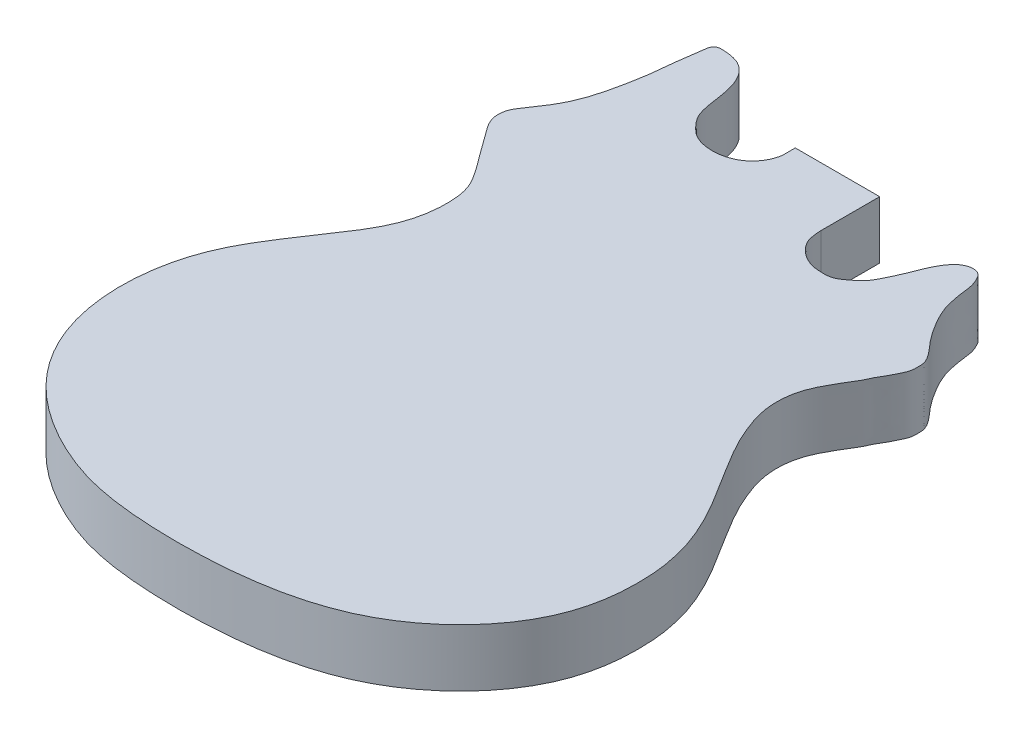
ISO-10303-21;
HEADER;
FILE_DESCRIPTION(('STEP AP214'),'2;1');
FILE_NAME('part.step','',(''),(''),'','','');
FILE_SCHEMA(('AUTOMOTIVE_DESIGN { 1 0 10303 214 1 1 1 1 }'));
ENDSEC;
DATA;
#1=APPLICATION_CONTEXT('core data for automotive mechanical design processes');
#2=APPLICATION_PROTOCOL_DEFINITION('international standard','automotive_design',2000,#1);
#3=PRODUCT_CONTEXT('',#1,'mechanical');
#4=PRODUCT('Part','Part','',(#3));
#5=PRODUCT_RELATED_PRODUCT_CATEGORY('part','',(#4));
#6=PRODUCT_DEFINITION_FORMATION('','',#4);
#7=PRODUCT_DEFINITION_CONTEXT('part definition',#1,'design');
#8=PRODUCT_DEFINITION('design','',#6,#7);
#9=PRODUCT_DEFINITION_SHAPE('','',#8);
#10=(LENGTH_UNIT() NAMED_UNIT(*) SI_UNIT(.MILLI.,.METRE.));
#11=(NAMED_UNIT(*) PLANE_ANGLE_UNIT() SI_UNIT($,.RADIAN.));
#12=(NAMED_UNIT(*) SI_UNIT($,.STERADIAN.) SOLID_ANGLE_UNIT());
#13=UNCERTAINTY_MEASURE_WITH_UNIT(LENGTH_MEASURE(1.E-05),#10,'distance_accuracy_value','');
#14=(GEOMETRIC_REPRESENTATION_CONTEXT(3) GLOBAL_UNCERTAINTY_ASSIGNED_CONTEXT((#13)) GLOBAL_UNIT_ASSIGNED_CONTEXT((#10,
#11,#12)) REPRESENTATION_CONTEXT('',''));
#15=CARTESIAN_POINT('',(0.,0.,0.));
#16=DIRECTION('',(0.,0.,1.));
#17=DIRECTION('',(1.,0.,0.));
#18=AXIS2_PLACEMENT_3D('',#15,#16,#17);
#19=CARTESIAN_POINT('',(366.883991573237,38.1,-590.196800388687));
#20=CARTESIAN_POINT('',(366.883991573237,38.1,-588.721907351672));
#21=CARTESIAN_POINT('',(367.195388840105,38.1,-585.91608313562));
#22=CARTESIAN_POINT('',(367.858429296302,38.1,-580.8687302054));
#23=CARTESIAN_POINT('',(370.218301131075,38.1,-576.638003720867));
#24=CARTESIAN_POINT('',(373.65596720719,38.1,-572.913912014376));
#25=CARTESIAN_POINT('',(377.743592341641,38.1,-569.646373817013));
#26=CARTESIAN_POINT('',(383.573889567356,38.1,-566.89859658351));
#27=CARTESIAN_POINT('',(390.451252724685,38.1,-566.258156737238));
#28=CARTESIAN_POINT('',(398.152644545368,38.1,-566.26153051699));
#29=CARTESIAN_POINT('',(404.588586625242,38.1,-571.033731222751));
#30=CARTESIAN_POINT('',(410.94967782355,38.1,-576.083704952531));
#31=CARTESIAN_POINT('',(415.321825984156,38.1,-584.401338354182));
#32=CARTESIAN_POINT('',(420.868571165765,38.1,-596.522757489768));
#33=CARTESIAN_POINT('',(424.957746783667,38.1,-609.03561704097));
#34=CARTESIAN_POINT('',(432.264639136456,38.1,-616.878386573491));
#35=CARTESIAN_POINT('',(437.693112662697,38.1,-619.093714190286));
#36=CARTESIAN_POINT('',(443.851152806028,38.1,-618.351944039827));
#37=CARTESIAN_POINT('',(446.515597074251,38.1,-613.311370609129));
#38=CARTESIAN_POINT('',(448.642354149267,38.1,-608.20368221213));
#39=CARTESIAN_POINT('',(449.063572551627,38.1,-602.574784341445));
#40=CARTESIAN_POINT('',(450.111658882252,38.1,-596.350402715852));
#41=CARTESIAN_POINT('',(451.680776414614,38.1,-587.862190500691));
#42=CARTESIAN_POINT('',(455.511908319344,38.1,-579.431931165118));
#43=CARTESIAN_POINT('',(460.76097729227,38.1,-570.728089525204));
#44=CARTESIAN_POINT('',(465.715796968027,38.1,-563.472999064495));
#45=CARTESIAN_POINT('',(471.225219476219,38.1,-557.625409544713));
#46=CARTESIAN_POINT('',(474.960319598487,38.1,-552.644338218503));
#47=CARTESIAN_POINT('',(477.041501222313,38.1,-548.646797619191));
#48=CARTESIAN_POINT('',(477.23214677891,38.1,-544.285595261758));
#49=CARTESIAN_POINT('',(477.179636977307,38.1,-538.900735945151));
#50=CARTESIAN_POINT('',(474.785544223896,38.1,-534.530358586376));
#51=CARTESIAN_POINT('',(471.971226614114,38.1,-528.396725226643));
#52=CARTESIAN_POINT('',(468.616650654354,38.1,-523.796068396358));
#53=CARTESIAN_POINT('',(466.538136299835,38.1,-518.275183369377));
#54=CARTESIAN_POINT('',(463.841343100274,38.1,-514.164090622732));
#55=CARTESIAN_POINT('',(460.300299461501,38.1,-508.10013855362));
#56=CARTESIAN_POINT('',(455.907780505751,38.1,-500.53125053286));
#57=CARTESIAN_POINT('',(452.391236223232,38.1,-492.092848174662));
#58=CARTESIAN_POINT('',(449.981513310686,38.1,-481.130095668032));
#59=CARTESIAN_POINT('',(450.56986982645,38.1,-467.189431041891));
#60=CARTESIAN_POINT('',(455.572045787537,38.1,-453.111149682231));
#61=CARTESIAN_POINT('',(460.750769387498,38.1,-441.535036147306));
#62=CARTESIAN_POINT('',(477.292195873029,38.1,-412.245927357529));
#63=CARTESIAN_POINT('',(496.864695249168,38.1,-386.695703012219));
#64=CARTESIAN_POINT('',(505.597355071709,38.1,-354.323158527018));
#65=CARTESIAN_POINT('',(507.493636288404,38.1,-344.994874506348));
#66=CARTESIAN_POINT('',(508.284460090054,38.1,-331.977291801679));
#67=CARTESIAN_POINT('',(508.412874582396,38.1,-314.027258268923));
#68=CARTESIAN_POINT('',(501.38819593534,38.1,-276.24400292031));
#69=CARTESIAN_POINT('',(472.863087886817,38.1,-240.162021779437));
#70=CARTESIAN_POINT('',(421.777866094053,38.1,-207.40855505496));
#71=CARTESIAN_POINT('',(367.396037565522,38.1,-198.275876581898));
#72=CARTESIAN_POINT('',(311.230783384065,38.1,-198.274487469048));
#73=CARTESIAN_POINT('',(272.054128070871,38.1,-202.886061008368));
#74=CARTESIAN_POINT('',(232.114648329101,38.1,-218.257045267777));
#75=CARTESIAN_POINT('',(197.642917692074,38.1,-242.053847810232));
#76=CARTESIAN_POINT('',(162.416064094691,38.1,-296.62980310084));
#77=CARTESIAN_POINT('',(164.477696434097,38.1,-358.459893242809));
#78=CARTESIAN_POINT('',(190.304262361722,38.1,-402.825501368096));
#79=CARTESIAN_POINT('',(206.202004436318,38.1,-426.42895489886));
#80=CARTESIAN_POINT('',(220.289060703208,38.1,-446.992370445698));
#81=CARTESIAN_POINT('',(226.76091013399,38.1,-467.505912702738));
#82=CARTESIAN_POINT('',(228.055204854964,38.1,-482.280124743083));
#83=CARTESIAN_POINT('',(226.268259516862,38.1,-497.50627952392));
#84=CARTESIAN_POINT('',(219.353810201759,38.1,-509.09371161702));
#85=CARTESIAN_POINT('',(209.93893550344,38.1,-521.261005131));
#86=CARTESIAN_POINT('',(201.563054898691,38.1,-533.324640229369));
#87=CARTESIAN_POINT('',(192.473656940867,38.1,-545.130127736662));
#88=CARTESIAN_POINT('',(193.603643441934,38.1,-555.883000736411));
#89=CARTESIAN_POINT('',(197.792322625061,38.1,-561.239934789617));
#90=CARTESIAN_POINT('',(200.594636736655,38.1,-565.606226537259));
#91=CARTESIAN_POINT('',(205.003411023042,38.1,-572.122896272146));
#92=CARTESIAN_POINT('',(212.951584214218,38.1,-586.194311067704));
#93=CARTESIAN_POINT('',(216.845453396514,38.1,-602.806368161893));
#94=CARTESIAN_POINT('',(219.76588512699,38.1,-617.781198680793));
#95=CARTESIAN_POINT('',(221.015835224723,38.1,-627.055193528547));
#96=CARTESIAN_POINT('',(222.02031854969,38.1,-639.516535990386));
#97=CARTESIAN_POINT('',(223.884773857362,38.1,-650.135707890283));
#98=CARTESIAN_POINT('',(224.787051186142,38.1,-658.216498006262));
#99=CARTESIAN_POINT('',(226.291917320773,38.1,-660.749716880113));
#100=CARTESIAN_POINT('',(229.520608103687,38.1,-661.36923398747));
#101=CARTESIAN_POINT('',(232.523523552588,38.1,-661.132849097433));
#102=CARTESIAN_POINT('',(237.44251503137,38.1,-660.672891522216));
#103=CARTESIAN_POINT('',(244.171776480064,38.1,-658.881964170693));
#104=CARTESIAN_POINT('',(253.716491973834,38.1,-649.500446484316));
#105=CARTESIAN_POINT('',(256.451919387518,38.1,-635.102250961051));
#106=CARTESIAN_POINT('',(258.04680198447,38.1,-622.776907993499));
#107=CARTESIAN_POINT('',(260.521637459537,38.1,-614.545187826302));
#108=CARTESIAN_POINT('',(265.12147439247,38.1,-608.811371734984));
#109=CARTESIAN_POINT('',(271.53625006759,38.1,-602.484679717465));
#110=CARTESIAN_POINT('',(280.756867836981,38.1,-599.677322856033));
#111=CARTESIAN_POINT('',(291.630992990078,38.1,-599.8424385362));
#112=CARTESIAN_POINT('',(303.022419832518,38.1,-604.493513432577));
#113=CARTESIAN_POINT('',(309.505892146127,38.1,-613.469666375511));
#114=CARTESIAN_POINT('',(311.004029832298,38.1,-619.764159781013));
#115=CARTESIAN_POINT('',(311.004029832298,38.1,-621.790166204477));
#116=B_SPLINE_CURVE_WITH_KNOTS('',3,(#19,#20,#21,#22,#23,#24,#25,#26,#27,#28,#29,#30,#31,#32,
#33,#34,#35,#36,#37,#38,#39,#40,#41,#42,#43,#44,#45,#46,#47,#48,#49,#50,#51,#52,#53,#54,#55,#56,
#57,#58,#59,#60,#61,#62,#63,#64,#65,#66,#67,#68,#69,#70,#71,#72,#73,#74,#75,#76,#77,#78,#79,#80,
#81,#82,#83,#84,#85,#86,#87,#88,#89,#90,#91,#92,#93,#94,#95,#96,#97,#98,#99,#100,#101,#102,#103,
#104,#105,#106,#107,#108,#109,#110,#111,#112,#113,#114,#115),.UNSPECIFIED.,.F.,.F.,(4,1,1,1,1,1,
1,1,1,1,1,1,1,1,1,1,1,1,1,1,1,1,1,1,1,1,1,1,1,1,1,1,1,1,1,1,1,1,1,1,1,1,1,1,1,1,1,1,1,1,1,1,1,1,
1,1,1,1,1,1,1,1,1,1,1,1,1,1,1,1,1,1,1,1,1,1,1,1,1,1,1,1,1,1,1,1,1,1,1,1,1,1,1,1,4),(0.,
0.00315984832424223,0.00598230283433761,0.0108030037522482,0.0131286526565183,
0.0167778382747816,0.0219032794096181,0.0265497101455225,0.0314762243547718,0.0378061147689159,
0.0429568722171719,0.0487095950388073,0.05744195608859,0.0715919764001841,0.0761749651618714,
0.0796813924682189,0.0838840611060315,0.0878663155482083,0.0909398123853913,0.0957814430291346,
0.0996936523589228,0.104433830542645,0.114115253223475,0.119168673381544,0.126116005677408,
0.132777460316876,0.136226348154954,0.139412495648646,0.14214922666899,0.145425834143596,
0.150746318053862,0.152450281949558,0.159837563892792,0.162719905887376,0.164949512048993,
0.170281450475884,0.177695976370776,0.183572244855774,0.189678103632012,0.20149587960119,
0.21268264586229,0.221324950854022,0.228495674179077,0.284386017988502,0.287603832508255,
0.299887622540742,0.304568308649574,0.315372444174485,0.338107475039065,0.385165149024817,
0.407745679241347,0.46677501098775,0.498358572926295,0.527971357744565,0.549960144557567,
0.589189402534234,0.614610655246806,0.686418410703885,0.703720531251532,0.72406190580588,
0.747167858403725,0.756237662218265,0.769574979000264,0.778551982660278,0.788342064343957,
0.797786555675844,0.811366726548495,0.819933164655917,0.828590352605488,0.831653221043367,
0.834390534526627,0.839639752657829,0.848425383146413,0.86865252600135,0.875498573809774,
0.880975370758716,0.888570806289868,0.902140733942949,0.903842093706588,0.905977305142117,
0.907808843848576,0.910448994236638,0.912455766682357,0.918334082296584,0.924868891125057,
0.939757556891163,0.948091562168456,0.951602906948793,0.957871748649608,0.963487250530591,
0.970559079902365,0.977641605779787,0.986453336435077,0.995699314257648,1.),.UNSPECIFIED.);
#117=DIRECTION('',(0.,-1.,0.));
#118=VECTOR('',#117,1.);
#119=SURFACE_OF_LINEAR_EXTRUSION('',#116,#118);
#120=CARTESIAN_POINT('',(366.883991573237,0.,-590.196800388687));
#121=CARTESIAN_POINT('',(366.883991573237,0.,-588.721907351672));
#122=CARTESIAN_POINT('',(367.195388840105,0.,-585.91608313562));
#123=CARTESIAN_POINT('',(367.858429296302,0.,-580.8687302054));
#124=CARTESIAN_POINT('',(370.218301131075,0.,-576.638003720867));
#125=CARTESIAN_POINT('',(373.65596720719,0.,-572.913912014376));
#126=CARTESIAN_POINT('',(377.743592341641,0.,-569.646373817013));
#127=CARTESIAN_POINT('',(383.573889567356,0.,-566.89859658351));
#128=CARTESIAN_POINT('',(390.451252724685,0.,-566.258156737238));
#129=CARTESIAN_POINT('',(398.152644545368,0.,-566.26153051699));
#130=CARTESIAN_POINT('',(404.588586625242,0.,-571.033731222751));
#131=CARTESIAN_POINT('',(410.94967782355,0.,-576.083704952531));
#132=CARTESIAN_POINT('',(415.321825984156,0.,-584.401338354182));
#133=CARTESIAN_POINT('',(420.868571165765,0.,-596.522757489768));
#134=CARTESIAN_POINT('',(424.957746783667,0.,-609.03561704097));
#135=CARTESIAN_POINT('',(432.264639136456,0.,-616.878386573491));
#136=CARTESIAN_POINT('',(437.693112662697,0.,-619.093714190286));
#137=CARTESIAN_POINT('',(443.851152806028,0.,-618.351944039827));
#138=CARTESIAN_POINT('',(446.515597074251,0.,-613.311370609129));
#139=CARTESIAN_POINT('',(448.642354149267,0.,-608.20368221213));
#140=CARTESIAN_POINT('',(449.063572551627,0.,-602.574784341445));
#141=CARTESIAN_POINT('',(450.111658882252,0.,-596.350402715852));
#142=CARTESIAN_POINT('',(451.680776414614,0.,-587.862190500691));
#143=CARTESIAN_POINT('',(455.511908319344,0.,-579.431931165118));
#144=CARTESIAN_POINT('',(460.76097729227,0.,-570.728089525204));
#145=CARTESIAN_POINT('',(465.715796968027,0.,-563.472999064495));
#146=CARTESIAN_POINT('',(471.225219476219,0.,-557.625409544713));
#147=CARTESIAN_POINT('',(474.960319598487,0.,-552.644338218503));
#148=CARTESIAN_POINT('',(477.041501222313,0.,-548.646797619191));
#149=CARTESIAN_POINT('',(477.23214677891,0.,-544.285595261758));
#150=CARTESIAN_POINT('',(477.179636977307,0.,-538.900735945151));
#151=CARTESIAN_POINT('',(474.785544223896,0.,-534.530358586376));
#152=CARTESIAN_POINT('',(471.971226614114,0.,-528.396725226643));
#153=CARTESIAN_POINT('',(468.616650654354,0.,-523.796068396358));
#154=CARTESIAN_POINT('',(466.538136299835,0.,-518.275183369377));
#155=CARTESIAN_POINT('',(463.841343100274,0.,-514.164090622732));
#156=CARTESIAN_POINT('',(460.300299461501,0.,-508.10013855362));
#157=CARTESIAN_POINT('',(455.907780505751,0.,-500.53125053286));
#158=CARTESIAN_POINT('',(452.391236223232,0.,-492.092848174662));
#159=CARTESIAN_POINT('',(449.981513310686,0.,-481.130095668032));
#160=CARTESIAN_POINT('',(450.56986982645,0.,-467.189431041891));
#161=CARTESIAN_POINT('',(455.572045787537,0.,-453.111149682231));
#162=CARTESIAN_POINT('',(460.750769387498,0.,-441.535036147306));
#163=CARTESIAN_POINT('',(477.292195873029,0.,-412.245927357529));
#164=CARTESIAN_POINT('',(496.864695249168,0.,-386.695703012219));
#165=CARTESIAN_POINT('',(505.597355071709,0.,-354.323158527018));
#166=CARTESIAN_POINT('',(507.493636288404,0.,-344.994874506348));
#167=CARTESIAN_POINT('',(508.284460090054,0.,-331.977291801679));
#168=CARTESIAN_POINT('',(508.412874582396,0.,-314.027258268923));
#169=CARTESIAN_POINT('',(501.38819593534,0.,-276.24400292031));
#170=CARTESIAN_POINT('',(472.863087886817,0.,-240.162021779437));
#171=CARTESIAN_POINT('',(421.777866094053,0.,-207.40855505496));
#172=CARTESIAN_POINT('',(367.396037565522,0.,-198.275876581898));
#173=CARTESIAN_POINT('',(311.230783384065,0.,-198.274487469048));
#174=CARTESIAN_POINT('',(272.054128070871,0.,-202.886061008368));
#175=CARTESIAN_POINT('',(232.114648329101,0.,-218.257045267777));
#176=CARTESIAN_POINT('',(197.642917692074,0.,-242.053847810232));
#177=CARTESIAN_POINT('',(162.416064094691,0.,-296.62980310084));
#178=CARTESIAN_POINT('',(164.477696434097,0.,-358.459893242809));
#179=CARTESIAN_POINT('',(190.304262361722,0.,-402.825501368096));
#180=CARTESIAN_POINT('',(206.202004436318,0.,-426.42895489886));
#181=CARTESIAN_POINT('',(220.289060703208,0.,-446.992370445698));
#182=CARTESIAN_POINT('',(226.76091013399,0.,-467.505912702738));
#183=CARTESIAN_POINT('',(228.055204854964,0.,-482.280124743083));
#184=CARTESIAN_POINT('',(226.268259516862,0.,-497.50627952392));
#185=CARTESIAN_POINT('',(219.353810201759,0.,-509.09371161702));
#186=CARTESIAN_POINT('',(209.93893550344,0.,-521.261005131));
#187=CARTESIAN_POINT('',(201.563054898691,0.,-533.324640229369));
#188=CARTESIAN_POINT('',(192.473656940867,0.,-545.130127736662));
#189=CARTESIAN_POINT('',(193.603643441934,0.,-555.883000736411));
#190=CARTESIAN_POINT('',(197.792322625061,0.,-561.239934789617));
#191=CARTESIAN_POINT('',(200.594636736655,0.,-565.606226537259));
#192=CARTESIAN_POINT('',(205.003411023042,0.,-572.122896272146));
#193=CARTESIAN_POINT('',(212.951584214218,0.,-586.194311067704));
#194=CARTESIAN_POINT('',(216.845453396514,0.,-602.806368161893));
#195=CARTESIAN_POINT('',(219.76588512699,0.,-617.781198680793));
#196=CARTESIAN_POINT('',(221.015835224723,0.,-627.055193528547));
#197=CARTESIAN_POINT('',(222.02031854969,0.,-639.516535990386));
#198=CARTESIAN_POINT('',(223.884773857362,0.,-650.135707890283));
#199=CARTESIAN_POINT('',(224.787051186142,0.,-658.216498006262));
#200=CARTESIAN_POINT('',(226.291917320773,0.,-660.749716880113));
#201=CARTESIAN_POINT('',(229.520608103687,0.,-661.36923398747));
#202=CARTESIAN_POINT('',(232.523523552588,0.,-661.132849097433));
#203=CARTESIAN_POINT('',(237.44251503137,0.,-660.672891522216));
#204=CARTESIAN_POINT('',(244.171776480064,0.,-658.881964170693));
#205=CARTESIAN_POINT('',(253.716491973834,0.,-649.500446484316));
#206=CARTESIAN_POINT('',(256.451919387518,0.,-635.102250961051));
#207=CARTESIAN_POINT('',(258.04680198447,0.,-622.776907993499));
#208=CARTESIAN_POINT('',(260.521637459537,0.,-614.545187826302));
#209=CARTESIAN_POINT('',(265.12147439247,0.,-608.811371734984));
#210=CARTESIAN_POINT('',(271.53625006759,0.,-602.484679717465));
#211=CARTESIAN_POINT('',(280.756867836981,0.,-599.677322856033));
#212=CARTESIAN_POINT('',(291.630992990078,0.,-599.8424385362));
#213=CARTESIAN_POINT('',(303.022419832518,0.,-604.493513432577));
#214=CARTESIAN_POINT('',(309.505892146127,0.,-613.469666375511));
#215=CARTESIAN_POINT('',(311.004029832298,0.,-619.764159781013));
#216=CARTESIAN_POINT('',(311.004029832298,0.,-621.790166204477));
#217=B_SPLINE_CURVE_WITH_KNOTS('',3,(#120,#121,#122,#123,#124,#125,#126,#127,#128,#129,#130,
#131,#132,#133,#134,#135,#136,#137,#138,#139,#140,#141,#142,#143,#144,#145,#146,#147,#148,#149,
#150,#151,#152,#153,#154,#155,#156,#157,#158,#159,#160,#161,#162,#163,#164,#165,#166,#167,#168,
#169,#170,#171,#172,#173,#174,#175,#176,#177,#178,#179,#180,#181,#182,#183,#184,#185,#186,#187,
#188,#189,#190,#191,#192,#193,#194,#195,#196,#197,#198,#199,#200,#201,#202,#203,#204,#205,#206,
#207,#208,#209,#210,#211,#212,#213,#214,#215,#216),.UNSPECIFIED.,.F.,.F.,(4,1,1,1,1,1,1,1,1,1,1,
1,1,1,1,1,1,1,1,1,1,1,1,1,1,1,1,1,1,1,1,1,1,1,1,1,1,1,1,1,1,1,1,1,1,1,1,1,1,1,1,1,1,1,1,1,1,1,1,
1,1,1,1,1,1,1,1,1,1,1,1,1,1,1,1,1,1,1,1,1,1,1,1,1,1,1,1,1,1,1,1,1,1,1,4),(0.,
0.00315984832424223,0.00598230283433761,0.0108030037522482,0.0131286526565183,
0.0167778382747816,0.0219032794096181,0.0265497101455225,0.0314762243547718,0.0378061147689159,
0.0429568722171719,0.0487095950388073,0.05744195608859,0.0715919764001841,0.0761749651618714,
0.0796813924682189,0.0838840611060315,0.0878663155482083,0.0909398123853913,0.0957814430291346,
0.0996936523589228,0.104433830542645,0.114115253223475,0.119168673381544,0.126116005677408,
0.132777460316876,0.136226348154954,0.139412495648646,0.14214922666899,0.145425834143596,
0.150746318053862,0.152450281949558,0.159837563892792,0.162719905887376,0.164949512048993,
0.170281450475884,0.177695976370776,0.183572244855774,0.189678103632012,0.20149587960119,
0.21268264586229,0.221324950854022,0.228495674179077,0.284386017988502,0.287603832508255,
0.299887622540742,0.304568308649574,0.315372444174485,0.338107475039065,0.385165149024817,
0.407745679241347,0.46677501098775,0.498358572926295,0.527971357744565,0.549960144557567,
0.589189402534234,0.614610655246806,0.686418410703885,0.703720531251532,0.72406190580588,
0.747167858403725,0.756237662218265,0.769574979000264,0.778551982660278,0.788342064343957,
0.797786555675844,0.811366726548495,0.819933164655917,0.828590352605488,0.831653221043367,
0.834390534526627,0.839639752657829,0.848425383146413,0.86865252600135,0.875498573809774,
0.880975370758716,0.888570806289868,0.902140733942949,0.903842093706588,0.905977305142117,
0.907808843848576,0.910448994236638,0.912455766682357,0.918334082296584,0.924868891125057,
0.939757556891163,0.948091562168456,0.951602906948793,0.957871748649608,0.963487250530591,
0.970559079902365,0.977641605779787,0.986453336435077,0.995699314257648,1.),.UNSPECIFIED.);
#218=CARTESIAN_POINT('',(366.883991573237,0.,-590.196800388687));
#219=VERTEX_POINT('',#218);
#220=CARTESIAN_POINT('',(311.004029832298,0.,-621.790166204477));
#221=VERTEX_POINT('',#220);
#222=EDGE_CURVE('E98',#219,#221,#217,.T.);
#223=ORIENTED_EDGE('',*,*,#222,.F.);
#224=DIRECTION('',(0.,-1.,0.));
#225=VECTOR('',#224,1.);
#226=CARTESIAN_POINT('',(366.883991573237,38.1,-590.196800388687));
#227=LINE('',#226,#225);
#228=CARTESIAN_POINT('',(366.883991573237,38.1,-590.196800388687));
#229=VERTEX_POINT('',#228);
#230=EDGE_CURVE('E11',#229,#219,#227,.T.);
#231=ORIENTED_EDGE('',*,*,#230,.F.);
#232=CARTESIAN_POINT('',(311.004029832298,38.1,-621.790166204477));
#233=VERTEX_POINT('',#232);
#234=EDGE_CURVE('E91',#229,#233,#116,.T.);
#235=ORIENTED_EDGE('',*,*,#234,.T.);
#236=DIRECTION('',(0.,-1.,0.));
#237=VECTOR('',#236,1.);
#238=CARTESIAN_POINT('',(311.004029832298,38.1,-621.790166204477));
#239=LINE('',#238,#237);
#240=EDGE_CURVE('E52',#233,#221,#239,.T.);
#241=ORIENTED_EDGE('',*,*,#240,.T.);
#242=EDGE_LOOP('',(#223,#231,#235,#241));
#243=FACE_BOUND('',#242,.T.);
#244=ADVANCED_FACE('F35',(#243),#119,.T.);
#245=CARTESIAN_POINT('',(366.883991573238,38.1,-5.24634708778697E-13));
#246=DIRECTION('',(1.,0.,0.));
#247=DIRECTION('',(0.,0.,-1.));
#248=AXIS2_PLACEMENT_3D('',#245,#246,#247);
#249=PLANE('',#248);
#250=DIRECTION('',(0.,0.,1.));
#251=VECTOR('',#250,1.);
#252=CARTESIAN_POINT('',(366.883991573238,0.,-5.24634708778697E-13));
#253=LINE('',#252,#251);
#254=CARTESIAN_POINT('',(366.883991573237,0.,-629.016482731016));
#255=VERTEX_POINT('',#254);
#256=EDGE_CURVE('E82',#255,#219,#253,.T.);
#257=ORIENTED_EDGE('',*,*,#256,.F.);
#258=DIRECTION('',(0.,-1.,0.));
#259=VECTOR('',#258,1.);
#260=CARTESIAN_POINT('',(366.883991573237,38.1,-629.016482731016));
#261=LINE('',#260,#259);
#262=CARTESIAN_POINT('',(366.883991573237,38.1,-629.016482731016));
#263=VERTEX_POINT('',#262);
#264=EDGE_CURVE('E44',#263,#255,#261,.T.);
#265=ORIENTED_EDGE('',*,*,#264,.F.);
#266=DIRECTION('',(0.,0.,1.));
#267=VECTOR('',#266,1.);
#268=CARTESIAN_POINT('',(366.883991573238,38.1,-5.24634708778697E-13));
#269=LINE('',#268,#267);
#270=EDGE_CURVE('E80',#263,#229,#269,.T.);
#271=ORIENTED_EDGE('',*,*,#270,.T.);
#272=ORIENTED_EDGE('',*,*,#230,.T.);
#273=EDGE_LOOP('',(#257,#265,#271,#272));
#274=FACE_BOUND('',#273,.T.);
#275=ADVANCED_FACE('F79',(#274),#249,.T.);
#276=CARTESIAN_POINT('',(0.,38.1,-629.016482731016));
#277=DIRECTION('',(0.,0.,-1.));
#278=DIRECTION('',(-1.,0.,0.));
#279=AXIS2_PLACEMENT_3D('',#276,#277,#278);
#280=PLANE('',#279);
#281=DIRECTION('',(1.,0.,0.));
#282=VECTOR('',#281,1.);
#283=CARTESIAN_POINT('',(0.,0.,-629.016482731016));
#284=LINE('',#283,#282);
#285=CARTESIAN_POINT('',(311.004029832298,0.,-629.016482731016));
#286=VERTEX_POINT('',#285);
#287=EDGE_CURVE('E106',#286,#255,#284,.T.);
#288=ORIENTED_EDGE('',*,*,#287,.F.);
#289=DIRECTION('',(0.,-1.,0.));
#290=VECTOR('',#289,1.);
#291=CARTESIAN_POINT('',(311.004029832298,38.1,-629.016482731016));
#292=LINE('',#291,#290);
#293=CARTESIAN_POINT('',(311.004029832298,38.1,-629.016482731016));
#294=VERTEX_POINT('',#293);
#295=EDGE_CURVE('E65',#294,#286,#292,.T.);
#296=ORIENTED_EDGE('',*,*,#295,.F.);
#297=DIRECTION('',(1.,0.,0.));
#298=VECTOR('',#297,1.);
#299=CARTESIAN_POINT('',(0.,38.1,-629.016482731016));
#300=LINE('',#299,#298);
#301=EDGE_CURVE('E90',#294,#263,#300,.T.);
#302=ORIENTED_EDGE('',*,*,#301,.T.);
#303=ORIENTED_EDGE('',*,*,#264,.T.);
#304=EDGE_LOOP('',(#288,#296,#302,#303));
#305=FACE_BOUND('',#304,.T.);
#306=ADVANCED_FACE('F93',(#305),#280,.T.);
#307=CARTESIAN_POINT('',(311.004029832298,38.1,0.));
#308=DIRECTION('',(-1.,0.,0.));
#309=DIRECTION('',(0.,0.,1.));
#310=AXIS2_PLACEMENT_3D('',#307,#308,#309);
#311=PLANE('',#310);
#312=DIRECTION('',(0.,0.,-1.));
#313=VECTOR('',#312,1.);
#314=CARTESIAN_POINT('',(311.004029832298,0.,0.));
#315=LINE('',#314,#313);
#316=EDGE_CURVE('E108',#221,#286,#315,.T.);
#317=ORIENTED_EDGE('',*,*,#316,.F.);
#318=ORIENTED_EDGE('',*,*,#240,.F.);
#319=DIRECTION('',(0.,0.,-1.));
#320=VECTOR('',#319,1.);
#321=CARTESIAN_POINT('',(311.004029832298,38.1,0.));
#322=LINE('',#321,#320);
#323=EDGE_CURVE('E94',#233,#294,#322,.T.);
#324=ORIENTED_EDGE('',*,*,#323,.T.);
#325=ORIENTED_EDGE('',*,*,#295,.T.);
#326=EDGE_LOOP('',(#317,#318,#324,#325));
#327=FACE_BOUND('',#326,.T.);
#328=ADVANCED_FACE('F119',(#327),#311,.T.);
#329=CARTESIAN_POINT('',(0.,38.1,0.));
#330=DIRECTION('',(0.,1.,0.));
#331=DIRECTION('',(0.,0.,1.));
#332=AXIS2_PLACEMENT_3D('',#329,#330,#331);
#333=PLANE('',#332);
#334=ORIENTED_EDGE('',*,*,#234,.F.);
#335=ORIENTED_EDGE('',*,*,#270,.F.);
#336=ORIENTED_EDGE('',*,*,#301,.F.);
#337=ORIENTED_EDGE('',*,*,#323,.F.);
#338=EDGE_LOOP('',(#334,#335,#336,#337));
#339=FACE_BOUND('',#338,.T.);
#340=ADVANCED_FACE('F88',(#339),#333,.T.);
#341=CARTESIAN_POINT('',(0.,0.,0.));
#342=DIRECTION('',(0.,1.,0.));
#343=DIRECTION('',(0.,0.,1.));
#344=AXIS2_PLACEMENT_3D('',#341,#342,#343);
#345=PLANE('',#344);
#346=ORIENTED_EDGE('',*,*,#222,.T.);
#347=ORIENTED_EDGE('',*,*,#316,.T.);
#348=ORIENTED_EDGE('',*,*,#287,.T.);
#349=ORIENTED_EDGE('',*,*,#256,.T.);
#350=EDGE_LOOP('',(#346,#347,#348,#349));
#351=FACE_BOUND('',#350,.T.);
#352=ADVANCED_FACE('F126',(#351),#345,.F.);
#353=CLOSED_SHELL('',(#244,#275,#306,#328,#340,#352));
#354=MANIFOLD_SOLID_BREP('B2',#353);
#355=ADVANCED_BREP_SHAPE_REPRESENTATION('',(#18,#354),#14);
#356=SHAPE_DEFINITION_REPRESENTATION(#9,#355);
ENDSEC;
END-ISO-10303-21;
